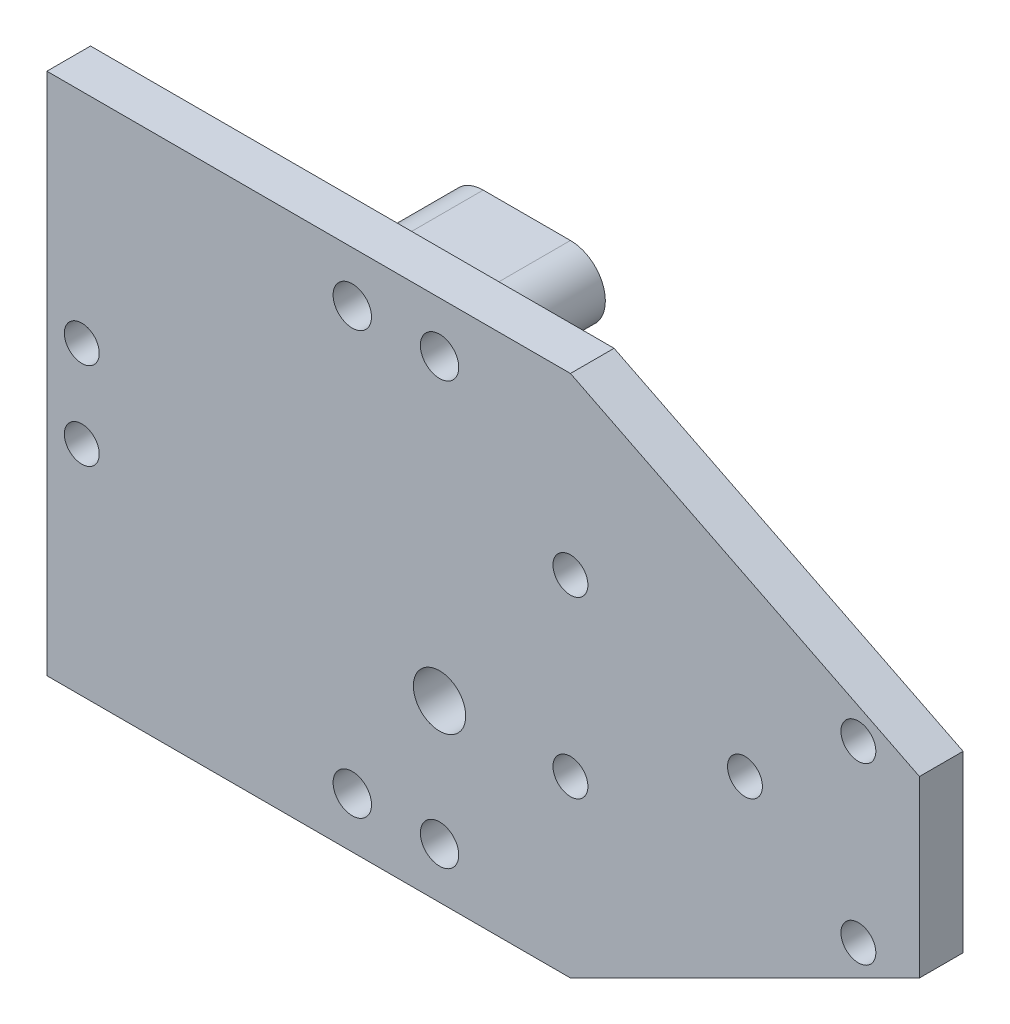
ISO-10303-21;
HEADER;
FILE_DESCRIPTION(('STEP AP214'),'2;1');
FILE_NAME('part.step','',(''),(''),'','','');
FILE_SCHEMA(('AUTOMOTIVE_DESIGN { 1 0 10303 214 1 1 1 1 }'));
ENDSEC;
DATA;
#1=APPLICATION_CONTEXT('core data for automotive mechanical design processes');
#2=APPLICATION_PROTOCOL_DEFINITION('international standard','automotive_design',2000,#1);
#3=PRODUCT_CONTEXT('',#1,'mechanical');
#4=PRODUCT('Part','Part','',(#3));
#5=PRODUCT_RELATED_PRODUCT_CATEGORY('part','',(#4));
#6=PRODUCT_DEFINITION_FORMATION('','',#4);
#7=PRODUCT_DEFINITION_CONTEXT('part definition',#1,'design');
#8=PRODUCT_DEFINITION('design','',#6,#7);
#9=PRODUCT_DEFINITION_SHAPE('','',#8);
#10=(LENGTH_UNIT() NAMED_UNIT(*) SI_UNIT(.MILLI.,.METRE.));
#11=(NAMED_UNIT(*) PLANE_ANGLE_UNIT() SI_UNIT($,.RADIAN.));
#12=(NAMED_UNIT(*) SI_UNIT($,.STERADIAN.) SOLID_ANGLE_UNIT());
#13=UNCERTAINTY_MEASURE_WITH_UNIT(LENGTH_MEASURE(1.E-05),#10,'distance_accuracy_value','');
#14=(GEOMETRIC_REPRESENTATION_CONTEXT(3) GLOBAL_UNCERTAINTY_ASSIGNED_CONTEXT((#13)) GLOBAL_UNIT_ASSIGNED_CONTEXT((#10,
#11,#12)) REPRESENTATION_CONTEXT('',''));
#15=CARTESIAN_POINT('',(0.,0.,0.));
#16=DIRECTION('',(0.,0.,1.));
#17=DIRECTION('',(1.,0.,0.));
#18=AXIS2_PLACEMENT_3D('',#15,#16,#17);
#19=CARTESIAN_POINT('',(0.,0.,2.5));
#20=DIRECTION('',(0.,0.,1.));
#21=DIRECTION('',(1.,0.,0.));
#22=AXIS2_PLACEMENT_3D('',#19,#20,#21);
#23=PLANE('',#22);
#24=CARTESIAN_POINT('',(80.,10.,2.5));
#25=DIRECTION('',(0.,0.,1.));
#26=DIRECTION('',(1.,0.,0.));
#27=AXIS2_PLACEMENT_3D('',#24,#25,#26);
#28=CIRCLE('',#27,2.);
#29=CARTESIAN_POINT('',(82.,10.,2.5));
#30=VERTEX_POINT('',#29);
#31=EDGE_CURVE('E218',#30,#30,#28,.T.);
#32=ORIENTED_EDGE('',*,*,#31,.F.);
#33=EDGE_LOOP('',(#32));
#34=FACE_BOUND('',#33,.T.);
#35=CARTESIAN_POINT('',(4.,5.,2.5));
#36=DIRECTION('',(0.,0.,1.));
#37=DIRECTION('',(1.,0.,0.));
#38=AXIS2_PLACEMENT_3D('',#35,#36,#37);
#39=CIRCLE('',#38,2.);
#40=CARTESIAN_POINT('',(6.,5.,2.5));
#41=VERTEX_POINT('',#40);
#42=EDGE_CURVE('E224',#41,#41,#39,.T.);
#43=ORIENTED_EDGE('',*,*,#42,.F.);
#44=EDGE_LOOP('',(#43));
#45=FACE_BOUND('',#44,.T.);
#46=CARTESIAN_POINT('',(4.,15.,2.5));
#47=DIRECTION('',(0.,0.,1.));
#48=DIRECTION('',(1.,0.,0.));
#49=AXIS2_PLACEMENT_3D('',#46,#47,#48);
#50=CIRCLE('',#49,2.);
#51=CARTESIAN_POINT('',(6.,15.,2.5));
#52=VERTEX_POINT('',#51);
#53=EDGE_CURVE('E208',#52,#52,#50,.T.);
#54=ORIENTED_EDGE('',*,*,#53,.F.);
#55=EDGE_LOOP('',(#54));
#56=FACE_BOUND('',#55,.T.);
#57=CARTESIAN_POINT('',(35.,-14.2,2.5));
#58=DIRECTION('',(0.,0.,1.));
#59=DIRECTION('',(1.,0.,0.));
#60=AXIS2_PLACEMENT_3D('',#57,#58,#59);
#61=CIRCLE('',#60,2.2);
#62=CARTESIAN_POINT('',(37.2,-14.2,2.5));
#63=VERTEX_POINT('',#62);
#64=EDGE_CURVE('E234',#63,#63,#61,.T.);
#65=ORIENTED_EDGE('',*,*,#64,.F.);
#66=EDGE_LOOP('',(#65));
#67=FACE_BOUND('',#66,.T.);
#68=CARTESIAN_POINT('',(35.,34.2,2.5));
#69=DIRECTION('',(0.,0.,1.));
#70=DIRECTION('',(1.,0.,0.));
#71=AXIS2_PLACEMENT_3D('',#68,#69,#70);
#72=CIRCLE('',#71,2.2);
#73=CARTESIAN_POINT('',(37.2,34.2,2.5));
#74=VERTEX_POINT('',#73);
#75=EDGE_CURVE('E240',#74,#74,#72,.T.);
#76=ORIENTED_EDGE('',*,*,#75,.F.);
#77=EDGE_LOOP('',(#76));
#78=FACE_BOUND('',#77,.T.);
#79=CARTESIAN_POINT('',(93.,0.,2.5));
#80=DIRECTION('',(0.,0.,1.));
#81=DIRECTION('',(1.,0.,0.));
#82=AXIS2_PLACEMENT_3D('',#79,#80,#81);
#83=CIRCLE('',#82,2.);
#84=CARTESIAN_POINT('',(95.,0.,2.5));
#85=VERTEX_POINT('',#84);
#86=EDGE_CURVE('E250',#85,#85,#83,.T.);
#87=ORIENTED_EDGE('',*,*,#86,.F.);
#88=EDGE_LOOP('',(#87));
#89=FACE_BOUND('',#88,.T.);
#90=CARTESIAN_POINT('',(60.,0.,2.5));
#91=DIRECTION('',(0.,0.,1.));
#92=DIRECTION('',(1.,0.,0.));
#93=AXIS2_PLACEMENT_3D('',#90,#91,#92);
#94=CIRCLE('',#93,2.);
#95=CARTESIAN_POINT('',(62.,0.,2.5));
#96=VERTEX_POINT('',#95);
#97=EDGE_CURVE('E262',#96,#96,#94,.T.);
#98=ORIENTED_EDGE('',*,*,#97,.F.);
#99=EDGE_LOOP('',(#98));
#100=FACE_BOUND('',#99,.T.);
#101=DIRECTION('',(0.,-1.,0.));
#102=VECTOR('',#101,1.);
#103=CARTESIAN_POINT('',(0.,40.,2.5));
#104=LINE('',#103,#102);
#105=CARTESIAN_POINT('',(0.,40.,2.5));
#106=VERTEX_POINT('',#105);
#107=CARTESIAN_POINT('',(0.,-20.,2.5));
#108=VERTEX_POINT('',#107);
#109=EDGE_CURVE('E274',#106,#108,#104,.T.);
#110=ORIENTED_EDGE('',*,*,#109,.T.);
#111=DIRECTION('',(1.,0.,0.));
#112=VECTOR('',#111,1.);
#113=CARTESIAN_POINT('',(0.,-20.,2.5));
#114=LINE('',#113,#112);
#115=CARTESIAN_POINT('',(60.,-20.,2.5));
#116=VERTEX_POINT('',#115);
#117=EDGE_CURVE('E277',#108,#116,#114,.T.);
#118=ORIENTED_EDGE('',*,*,#117,.T.);
#119=DIRECTION('',(0.894427190999916,0.447213595499958,0.));
#120=VECTOR('',#119,1.);
#121=CARTESIAN_POINT('',(60.,-20.,2.5));
#122=LINE('',#121,#120);
#123=CARTESIAN_POINT('',(100.,0.,2.5));
#124=VERTEX_POINT('',#123);
#125=EDGE_CURVE('E280',#116,#124,#122,.T.);
#126=ORIENTED_EDGE('',*,*,#125,.T.);
#127=DIRECTION('',(0.,1.,0.));
#128=VECTOR('',#127,1.);
#129=CARTESIAN_POINT('',(100.,0.,2.5));
#130=LINE('',#129,#128);
#131=CARTESIAN_POINT('',(100.,20.,2.5));
#132=VERTEX_POINT('',#131);
#133=EDGE_CURVE('E282',#124,#132,#130,.T.);
#134=ORIENTED_EDGE('',*,*,#133,.T.);
#135=DIRECTION('',(-0.894427190999916,0.447213595499958,0.));
#136=VECTOR('',#135,1.);
#137=CARTESIAN_POINT('',(100.,20.,2.5));
#138=LINE('',#137,#136);
#139=CARTESIAN_POINT('',(60.,40.,2.5));
#140=VERTEX_POINT('',#139);
#141=EDGE_CURVE('E284',#132,#140,#138,.T.);
#142=ORIENTED_EDGE('',*,*,#141,.T.);
#143=DIRECTION('',(-1.,0.,0.));
#144=VECTOR('',#143,1.);
#145=CARTESIAN_POINT('',(60.,40.,2.5));
#146=LINE('',#145,#144);
#147=EDGE_CURVE('E286',#140,#106,#146,.T.);
#148=ORIENTED_EDGE('',*,*,#147,.T.);
#149=EDGE_LOOP('',(#110,#118,#126,#134,#142,#148));
#150=FACE_BOUND('',#149,.T.);
#151=CARTESIAN_POINT('',(60.,20.,2.5));
#152=DIRECTION('',(0.,0.,1.));
#153=DIRECTION('',(1.,0.,0.));
#154=AXIS2_PLACEMENT_3D('',#151,#152,#153);
#155=CIRCLE('',#154,2.);
#156=CARTESIAN_POINT('',(62.,20.,2.5));
#157=VERTEX_POINT('',#156);
#158=EDGE_CURVE('E268',#157,#157,#155,.T.);
#159=ORIENTED_EDGE('',*,*,#158,.F.);
#160=EDGE_LOOP('',(#159));
#161=FACE_BOUND('',#160,.T.);
#162=CARTESIAN_POINT('',(93.,20.,2.5));
#163=DIRECTION('',(0.,0.,1.));
#164=DIRECTION('',(1.,0.,0.));
#165=AXIS2_PLACEMENT_3D('',#162,#163,#164);
#166=CIRCLE('',#165,2.);
#167=CARTESIAN_POINT('',(95.,20.,2.5));
#168=VERTEX_POINT('',#167);
#169=EDGE_CURVE('E256',#168,#168,#166,.T.);
#170=ORIENTED_EDGE('',*,*,#169,.F.);
#171=EDGE_LOOP('',(#170));
#172=FACE_BOUND('',#171,.T.);
#173=CARTESIAN_POINT('',(45.,0.,2.5));
#174=DIRECTION('',(0.,0.,1.));
#175=DIRECTION('',(1.,0.,0.));
#176=AXIS2_PLACEMENT_3D('',#173,#174,#175);
#177=CIRCLE('',#176,3.);
#178=CARTESIAN_POINT('',(48.,0.,2.5));
#179=VERTEX_POINT('',#178);
#180=EDGE_CURVE('E244',#179,#179,#177,.T.);
#181=ORIENTED_EDGE('',*,*,#180,.F.);
#182=EDGE_LOOP('',(#181));
#183=FACE_BOUND('',#182,.T.);
#184=CARTESIAN_POINT('',(45.,34.2,2.5));
#185=DIRECTION('',(0.,0.,1.));
#186=DIRECTION('',(1.,0.,0.));
#187=AXIS2_PLACEMENT_3D('',#184,#185,#186);
#188=CIRCLE('',#187,2.2);
#189=CARTESIAN_POINT('',(47.2,34.2,2.5));
#190=VERTEX_POINT('',#189);
#191=EDGE_CURVE('E237',#190,#190,#188,.T.);
#192=ORIENTED_EDGE('',*,*,#191,.F.);
#193=EDGE_LOOP('',(#192));
#194=FACE_BOUND('',#193,.T.);
#195=CARTESIAN_POINT('',(45.,-14.2,2.5));
#196=DIRECTION('',(0.,0.,1.));
#197=DIRECTION('',(1.,0.,0.));
#198=AXIS2_PLACEMENT_3D('',#195,#196,#197);
#199=CIRCLE('',#198,2.2);
#200=CARTESIAN_POINT('',(47.2,-14.2,2.5));
#201=VERTEX_POINT('',#200);
#202=EDGE_CURVE('E217',#201,#201,#199,.T.);
#203=ORIENTED_EDGE('',*,*,#202,.F.);
#204=EDGE_LOOP('',(#203));
#205=FACE_BOUND('',#204,.T.);
#206=ADVANCED_FACE('F33',(#34,#45,#56,#67,#78,#89,#100,#150,#161,#172,#183,#194,#205),#23,.T.);
#207=CARTESIAN_POINT('',(0.,0.,-2.5));
#208=DIRECTION('',(0.,0.,1.));
#209=DIRECTION('',(1.,0.,0.));
#210=AXIS2_PLACEMENT_3D('',#207,#208,#209);
#211=PLANE('',#210);
#212=DIRECTION('',(-1.,0.,0.));
#213=VECTOR('',#212,1.);
#214=CARTESIAN_POINT('',(0.,-10.2,-2.5));
#215=LINE('',#214,#213);
#216=CARTESIAN_POINT('',(45.,-10.2,-2.5));
#217=VERTEX_POINT('',#216);
#218=CARTESIAN_POINT('',(35.,-10.2,-2.5));
#219=VERTEX_POINT('',#218);
#220=EDGE_CURVE('E159',#217,#219,#215,.T.);
#221=ORIENTED_EDGE('',*,*,#220,.T.);
#222=CARTESIAN_POINT('',(35.,-14.2,-2.5));
#223=DIRECTION('',(0.,0.,1.));
#224=DIRECTION('',(1.,0.,0.));
#225=AXIS2_PLACEMENT_3D('',#222,#223,#224);
#226=CIRCLE('',#225,4.00000000000001);
#227=CARTESIAN_POINT('',(35.,-18.2,-2.5));
#228=VERTEX_POINT('',#227);
#229=EDGE_CURVE('E169',#219,#228,#226,.T.);
#230=ORIENTED_EDGE('',*,*,#229,.T.);
#231=DIRECTION('',(1.,0.,0.));
#232=VECTOR('',#231,1.);
#233=CARTESIAN_POINT('',(0.,-18.2,-2.5));
#234=LINE('',#233,#232);
#235=CARTESIAN_POINT('',(45.,-18.2,-2.5));
#236=VERTEX_POINT('',#235);
#237=EDGE_CURVE('E139',#228,#236,#234,.T.);
#238=ORIENTED_EDGE('',*,*,#237,.T.);
#239=CARTESIAN_POINT('',(45.,-14.2,-2.5));
#240=DIRECTION('',(0.,0.,1.));
#241=DIRECTION('',(1.,0.,0.));
#242=AXIS2_PLACEMENT_3D('',#239,#240,#241);
#243=CIRCLE('',#242,4.00000000000001);
#244=EDGE_CURVE('E48',#236,#217,#243,.T.);
#245=ORIENTED_EDGE('',*,*,#244,.T.);
#246=EDGE_LOOP('',(#221,#230,#238,#245));
#247=FACE_BOUND('',#246,.T.);
#248=DIRECTION('',(-1.,0.,0.));
#249=VECTOR('',#248,1.);
#250=CARTESIAN_POINT('',(0.,38.2,-2.5));
#251=LINE('',#250,#249);
#252=CARTESIAN_POINT('',(45.,38.2,-2.5));
#253=VERTEX_POINT('',#252);
#254=CARTESIAN_POINT('',(35.,38.2,-2.5));
#255=VERTEX_POINT('',#254);
#256=EDGE_CURVE('E188',#253,#255,#251,.T.);
#257=ORIENTED_EDGE('',*,*,#256,.T.);
#258=CARTESIAN_POINT('',(35.,34.2,-2.5));
#259=DIRECTION('',(0.,0.,1.));
#260=DIRECTION('',(1.,0.,0.));
#261=AXIS2_PLACEMENT_3D('',#258,#259,#260);
#262=CIRCLE('',#261,4.);
#263=CARTESIAN_POINT('',(35.,30.2,-2.5));
#264=VERTEX_POINT('',#263);
#265=EDGE_CURVE('E183',#255,#264,#262,.T.);
#266=ORIENTED_EDGE('',*,*,#265,.T.);
#267=DIRECTION('',(1.,0.,0.));
#268=VECTOR('',#267,1.);
#269=CARTESIAN_POINT('',(0.,30.2,-2.5));
#270=LINE('',#269,#268);
#271=CARTESIAN_POINT('',(45.,30.2,-2.5));
#272=VERTEX_POINT('',#271);
#273=EDGE_CURVE('E200',#264,#272,#270,.T.);
#274=ORIENTED_EDGE('',*,*,#273,.T.);
#275=CARTESIAN_POINT('',(45.,34.2,-2.5));
#276=DIRECTION('',(0.,0.,1.));
#277=DIRECTION('',(1.,0.,0.));
#278=AXIS2_PLACEMENT_3D('',#275,#276,#277);
#279=CIRCLE('',#278,4.);
#280=EDGE_CURVE('E56',#272,#253,#279,.T.);
#281=ORIENTED_EDGE('',*,*,#280,.T.);
#282=EDGE_LOOP('',(#257,#266,#274,#281));
#283=FACE_BOUND('',#282,.T.);
#284=CARTESIAN_POINT('',(80.,10.,-2.5));
#285=DIRECTION('',(0.,0.,1.));
#286=DIRECTION('',(1.,0.,0.));
#287=AXIS2_PLACEMENT_3D('',#284,#285,#286);
#288=CIRCLE('',#287,2.);
#289=CARTESIAN_POINT('',(82.,10.,-2.5));
#290=VERTEX_POINT('',#289);
#291=EDGE_CURVE('E214',#290,#290,#288,.T.);
#292=ORIENTED_EDGE('',*,*,#291,.T.);
#293=EDGE_LOOP('',(#292));
#294=FACE_BOUND('',#293,.T.);
#295=CARTESIAN_POINT('',(4.,5.,-2.5));
#296=DIRECTION('',(0.,0.,1.));
#297=DIRECTION('',(1.,0.,0.));
#298=AXIS2_PLACEMENT_3D('',#295,#296,#297);
#299=CIRCLE('',#298,2.);
#300=CARTESIAN_POINT('',(6.,5.,-2.5));
#301=VERTEX_POINT('',#300);
#302=EDGE_CURVE('E221',#301,#301,#299,.T.);
#303=ORIENTED_EDGE('',*,*,#302,.T.);
#304=EDGE_LOOP('',(#303));
#305=FACE_BOUND('',#304,.T.);
#306=CARTESIAN_POINT('',(4.,15.,-2.5));
#307=DIRECTION('',(0.,0.,1.));
#308=DIRECTION('',(1.,0.,0.));
#309=AXIS2_PLACEMENT_3D('',#306,#307,#308);
#310=CIRCLE('',#309,2.);
#311=CARTESIAN_POINT('',(6.,15.,-2.5));
#312=VERTEX_POINT('',#311);
#313=EDGE_CURVE('E227',#312,#312,#310,.T.);
#314=ORIENTED_EDGE('',*,*,#313,.T.);
#315=EDGE_LOOP('',(#314));
#316=FACE_BOUND('',#315,.T.);
#317=DIRECTION('',(0.,-1.,0.));
#318=VECTOR('',#317,1.);
#319=CARTESIAN_POINT('',(0.,40.,-2.5));
#320=LINE('',#319,#318);
#321=CARTESIAN_POINT('',(0.,40.,-2.5));
#322=VERTEX_POINT('',#321);
#323=CARTESIAN_POINT('',(0.,-20.,-2.5));
#324=VERTEX_POINT('',#323);
#325=EDGE_CURVE('E271',#322,#324,#320,.T.);
#326=ORIENTED_EDGE('',*,*,#325,.F.);
#327=DIRECTION('',(-1.,0.,0.));
#328=VECTOR('',#327,1.);
#329=CARTESIAN_POINT('',(60.,40.,-2.5));
#330=LINE('',#329,#328);
#331=CARTESIAN_POINT('',(60.,40.,-2.5));
#332=VERTEX_POINT('',#331);
#333=EDGE_CURVE('E278',#332,#322,#330,.T.);
#334=ORIENTED_EDGE('',*,*,#333,.F.);
#335=DIRECTION('',(-0.894427190999916,0.447213595499958,0.));
#336=VECTOR('',#335,1.);
#337=CARTESIAN_POINT('',(100.,20.,-2.5));
#338=LINE('',#337,#336);
#339=CARTESIAN_POINT('',(100.,20.,-2.5));
#340=VERTEX_POINT('',#339);
#341=EDGE_CURVE('E297',#340,#332,#338,.T.);
#342=ORIENTED_EDGE('',*,*,#341,.F.);
#343=DIRECTION('',(0.,1.,0.));
#344=VECTOR('',#343,1.);
#345=CARTESIAN_POINT('',(100.,0.,-2.5));
#346=LINE('',#345,#344);
#347=CARTESIAN_POINT('',(100.,0.,-2.5));
#348=VERTEX_POINT('',#347);
#349=EDGE_CURVE('E295',#348,#340,#346,.T.);
#350=ORIENTED_EDGE('',*,*,#349,.F.);
#351=DIRECTION('',(0.894427190999916,0.447213595499958,0.));
#352=VECTOR('',#351,1.);
#353=CARTESIAN_POINT('',(60.,-20.,-2.5));
#354=LINE('',#353,#352);
#355=CARTESIAN_POINT('',(60.,-20.,-2.5));
#356=VERTEX_POINT('',#355);
#357=EDGE_CURVE('E293',#356,#348,#354,.T.);
#358=ORIENTED_EDGE('',*,*,#357,.F.);
#359=DIRECTION('',(1.,0.,0.));
#360=VECTOR('',#359,1.);
#361=CARTESIAN_POINT('',(0.,-20.,-2.5));
#362=LINE('',#361,#360);
#363=EDGE_CURVE('E291',#324,#356,#362,.T.);
#364=ORIENTED_EDGE('',*,*,#363,.F.);
#365=EDGE_LOOP('',(#326,#334,#342,#350,#358,#364));
#366=FACE_BOUND('',#365,.T.);
#367=CARTESIAN_POINT('',(60.,20.,-2.5));
#368=DIRECTION('',(0.,0.,1.));
#369=DIRECTION('',(1.,0.,0.));
#370=AXIS2_PLACEMENT_3D('',#367,#368,#369);
#371=CIRCLE('',#370,2.);
#372=CARTESIAN_POINT('',(62.,20.,-2.5));
#373=VERTEX_POINT('',#372);
#374=EDGE_CURVE('E265',#373,#373,#371,.T.);
#375=ORIENTED_EDGE('',*,*,#374,.T.);
#376=EDGE_LOOP('',(#375));
#377=FACE_BOUND('',#376,.T.);
#378=CARTESIAN_POINT('',(60.,0.,-2.5));
#379=DIRECTION('',(0.,0.,1.));
#380=DIRECTION('',(1.,0.,0.));
#381=AXIS2_PLACEMENT_3D('',#378,#379,#380);
#382=CIRCLE('',#381,2.);
#383=CARTESIAN_POINT('',(62.,0.,-2.5));
#384=VERTEX_POINT('',#383);
#385=EDGE_CURVE('E259',#384,#384,#382,.T.);
#386=ORIENTED_EDGE('',*,*,#385,.T.);
#387=EDGE_LOOP('',(#386));
#388=FACE_BOUND('',#387,.T.);
#389=CARTESIAN_POINT('',(93.,20.,-2.5));
#390=DIRECTION('',(0.,0.,1.));
#391=DIRECTION('',(1.,0.,0.));
#392=AXIS2_PLACEMENT_3D('',#389,#390,#391);
#393=CIRCLE('',#392,2.);
#394=CARTESIAN_POINT('',(95.,20.,-2.5));
#395=VERTEX_POINT('',#394);
#396=EDGE_CURVE('E253',#395,#395,#393,.T.);
#397=ORIENTED_EDGE('',*,*,#396,.T.);
#398=EDGE_LOOP('',(#397));
#399=FACE_BOUND('',#398,.T.);
#400=CARTESIAN_POINT('',(93.,0.,-2.5));
#401=DIRECTION('',(0.,0.,1.));
#402=DIRECTION('',(1.,0.,0.));
#403=AXIS2_PLACEMENT_3D('',#400,#401,#402);
#404=CIRCLE('',#403,2.);
#405=CARTESIAN_POINT('',(95.,0.,-2.5));
#406=VERTEX_POINT('',#405);
#407=EDGE_CURVE('E247',#406,#406,#404,.T.);
#408=ORIENTED_EDGE('',*,*,#407,.T.);
#409=EDGE_LOOP('',(#408));
#410=FACE_BOUND('',#409,.T.);
#411=CARTESIAN_POINT('',(45.,0.,-2.5));
#412=DIRECTION('',(0.,0.,1.));
#413=DIRECTION('',(1.,0.,0.));
#414=AXIS2_PLACEMENT_3D('',#411,#412,#413);
#415=CIRCLE('',#414,3.);
#416=CARTESIAN_POINT('',(48.,0.,-2.5));
#417=VERTEX_POINT('',#416);
#418=EDGE_CURVE('E243',#417,#417,#415,.T.);
#419=ORIENTED_EDGE('',*,*,#418,.T.);
#420=EDGE_LOOP('',(#419));
#421=FACE_BOUND('',#420,.T.);
#422=ADVANCED_FACE('F321',(#247,#283,#294,#305,#316,#366,#377,#388,#399,#410,#421),#211,.F.);
#423=CARTESIAN_POINT('',(0.,40.,2.5));
#424=DIRECTION('',(1.,0.,0.));
#425=DIRECTION('',(0.,0.,-1.));
#426=AXIS2_PLACEMENT_3D('',#423,#424,#425);
#427=PLANE('',#426);
#428=ORIENTED_EDGE('',*,*,#325,.T.);
#429=DIRECTION('',(0.,0.,-1.));
#430=VECTOR('',#429,1.);
#431=CARTESIAN_POINT('',(0.,-20.,2.5));
#432=LINE('',#431,#430);
#433=EDGE_CURVE('E11',#108,#324,#432,.T.);
#434=ORIENTED_EDGE('',*,*,#433,.F.);
#435=ORIENTED_EDGE('',*,*,#109,.F.);
#436=DIRECTION('',(0.,0.,-1.));
#437=VECTOR('',#436,1.);
#438=CARTESIAN_POINT('',(0.,40.,2.5));
#439=LINE('',#438,#437);
#440=EDGE_CURVE('E288',#106,#322,#439,.T.);
#441=ORIENTED_EDGE('',*,*,#440,.T.);
#442=EDGE_LOOP('',(#428,#434,#435,#441));
#443=FACE_BOUND('',#442,.T.);
#444=ADVANCED_FACE('F35',(#443),#427,.F.);
#445=CARTESIAN_POINT('',(0.,-20.,2.5));
#446=DIRECTION('',(0.,1.,0.));
#447=DIRECTION('',(-1.,0.,0.));
#448=AXIS2_PLACEMENT_3D('',#445,#446,#447);
#449=PLANE('',#448);
#450=ORIENTED_EDGE('',*,*,#363,.T.);
#451=DIRECTION('',(0.,0.,-1.));
#452=VECTOR('',#451,1.);
#453=CARTESIAN_POINT('',(60.,-20.,2.5));
#454=LINE('',#453,#452);
#455=EDGE_CURVE('E41',#116,#356,#454,.T.);
#456=ORIENTED_EDGE('',*,*,#455,.F.);
#457=ORIENTED_EDGE('',*,*,#117,.F.);
#458=ORIENTED_EDGE('',*,*,#433,.T.);
#459=EDGE_LOOP('',(#450,#456,#457,#458));
#460=FACE_BOUND('',#459,.T.);
#461=ADVANCED_FACE('F339',(#460),#449,.F.);
#462=CARTESIAN_POINT('',(60.,-20.,2.5));
#463=DIRECTION('',(-0.447213595499958,0.894427190999916,0.));
#464=DIRECTION('',(-0.894427190999916,-0.447213595499958,0.));
#465=AXIS2_PLACEMENT_3D('',#462,#463,#464);
#466=PLANE('',#465);
#467=ORIENTED_EDGE('',*,*,#357,.T.);
#468=DIRECTION('',(0.,0.,-1.));
#469=VECTOR('',#468,1.);
#470=CARTESIAN_POINT('',(100.,0.,2.5));
#471=LINE('',#470,#469);
#472=EDGE_CURVE('E308',#124,#348,#471,.T.);
#473=ORIENTED_EDGE('',*,*,#472,.F.);
#474=ORIENTED_EDGE('',*,*,#125,.F.);
#475=ORIENTED_EDGE('',*,*,#455,.T.);
#476=EDGE_LOOP('',(#467,#473,#474,#475));
#477=FACE_BOUND('',#476,.T.);
#478=ADVANCED_FACE('F315',(#477),#466,.F.);
#479=CARTESIAN_POINT('',(100.,0.,2.5));
#480=DIRECTION('',(-1.,0.,0.));
#481=DIRECTION('',(0.,0.,1.));
#482=AXIS2_PLACEMENT_3D('',#479,#480,#481);
#483=PLANE('',#482);
#484=ORIENTED_EDGE('',*,*,#349,.T.);
#485=DIRECTION('',(0.,0.,-1.));
#486=VECTOR('',#485,1.);
#487=CARTESIAN_POINT('',(100.,20.,2.5));
#488=LINE('',#487,#486);
#489=EDGE_CURVE('E305',#132,#340,#488,.T.);
#490=ORIENTED_EDGE('',*,*,#489,.F.);
#491=ORIENTED_EDGE('',*,*,#133,.F.);
#492=ORIENTED_EDGE('',*,*,#472,.T.);
#493=EDGE_LOOP('',(#484,#490,#491,#492));
#494=FACE_BOUND('',#493,.T.);
#495=ADVANCED_FACE('F327',(#494),#483,.F.);
#496=CARTESIAN_POINT('',(100.,20.,2.5));
#497=DIRECTION('',(-0.447213595499958,-0.894427190999916,0.));
#498=DIRECTION('',(0.894427190999916,-0.447213595499958,0.));
#499=AXIS2_PLACEMENT_3D('',#496,#497,#498);
#500=PLANE('',#499);
#501=ORIENTED_EDGE('',*,*,#341,.T.);
#502=DIRECTION('',(0.,0.,-1.));
#503=VECTOR('',#502,1.);
#504=CARTESIAN_POINT('',(60.,40.,2.5));
#505=LINE('',#504,#503);
#506=EDGE_CURVE('E302',#140,#332,#505,.T.);
#507=ORIENTED_EDGE('',*,*,#506,.F.);
#508=ORIENTED_EDGE('',*,*,#141,.F.);
#509=ORIENTED_EDGE('',*,*,#489,.T.);
#510=EDGE_LOOP('',(#501,#507,#508,#509));
#511=FACE_BOUND('',#510,.T.);
#512=ADVANCED_FACE('F331',(#511),#500,.F.);
#513=CARTESIAN_POINT('',(60.,40.,2.5));
#514=DIRECTION('',(0.,-1.,0.));
#515=DIRECTION('',(1.,0.,0.));
#516=AXIS2_PLACEMENT_3D('',#513,#514,#515);
#517=PLANE('',#516);
#518=ORIENTED_EDGE('',*,*,#333,.T.);
#519=ORIENTED_EDGE('',*,*,#440,.F.);
#520=ORIENTED_EDGE('',*,*,#147,.F.);
#521=ORIENTED_EDGE('',*,*,#506,.T.);
#522=EDGE_LOOP('',(#518,#519,#520,#521));
#523=FACE_BOUND('',#522,.T.);
#524=ADVANCED_FACE('F342',(#523),#517,.F.);
#525=CARTESIAN_POINT('',(60.,20.,2.5));
#526=DIRECTION('',(0.,0.,-1.));
#527=DIRECTION('',(-1.,0.,0.));
#528=AXIS2_PLACEMENT_3D('',#525,#526,#527);
#529=CYLINDRICAL_SURFACE('',#528,2.);
#530=ORIENTED_EDGE('',*,*,#158,.T.);
#531=EDGE_LOOP('',(#530));
#532=FACE_BOUND('',#531,.T.);
#533=ORIENTED_EDGE('',*,*,#374,.F.);
#534=EDGE_LOOP('',(#533));
#535=FACE_BOUND('',#534,.T.);
#536=ADVANCED_FACE('F344',(#532,#535),#529,.F.);
#537=CARTESIAN_POINT('',(60.,0.,2.5));
#538=DIRECTION('',(0.,0.,-1.));
#539=DIRECTION('',(-1.,0.,0.));
#540=AXIS2_PLACEMENT_3D('',#537,#538,#539);
#541=CYLINDRICAL_SURFACE('',#540,2.);
#542=ORIENTED_EDGE('',*,*,#97,.T.);
#543=EDGE_LOOP('',(#542));
#544=FACE_BOUND('',#543,.T.);
#545=ORIENTED_EDGE('',*,*,#385,.F.);
#546=EDGE_LOOP('',(#545));
#547=FACE_BOUND('',#546,.T.);
#548=ADVANCED_FACE('F350',(#544,#547),#541,.F.);
#549=CARTESIAN_POINT('',(93.,20.,2.5));
#550=DIRECTION('',(0.,0.,-1.));
#551=DIRECTION('',(-1.,0.,0.));
#552=AXIS2_PLACEMENT_3D('',#549,#550,#551);
#553=CYLINDRICAL_SURFACE('',#552,2.);
#554=ORIENTED_EDGE('',*,*,#169,.T.);
#555=EDGE_LOOP('',(#554));
#556=FACE_BOUND('',#555,.T.);
#557=ORIENTED_EDGE('',*,*,#396,.F.);
#558=EDGE_LOOP('',(#557));
#559=FACE_BOUND('',#558,.T.);
#560=ADVANCED_FACE('F367',(#556,#559),#553,.F.);
#561=CARTESIAN_POINT('',(93.,0.,2.5));
#562=DIRECTION('',(0.,0.,-1.));
#563=DIRECTION('',(-1.,0.,0.));
#564=AXIS2_PLACEMENT_3D('',#561,#562,#563);
#565=CYLINDRICAL_SURFACE('',#564,2.);
#566=ORIENTED_EDGE('',*,*,#86,.T.);
#567=EDGE_LOOP('',(#566));
#568=FACE_BOUND('',#567,.T.);
#569=ORIENTED_EDGE('',*,*,#407,.F.);
#570=EDGE_LOOP('',(#569));
#571=FACE_BOUND('',#570,.T.);
#572=ADVANCED_FACE('F371',(#568,#571),#565,.F.);
#573=CARTESIAN_POINT('',(45.,0.,2.5));
#574=DIRECTION('',(0.,0.,-1.));
#575=DIRECTION('',(-1.,0.,0.));
#576=AXIS2_PLACEMENT_3D('',#573,#574,#575);
#577=CYLINDRICAL_SURFACE('',#576,3.);
#578=ORIENTED_EDGE('',*,*,#180,.T.);
#579=EDGE_LOOP('',(#578));
#580=FACE_BOUND('',#579,.T.);
#581=ORIENTED_EDGE('',*,*,#418,.F.);
#582=EDGE_LOOP('',(#581));
#583=FACE_BOUND('',#582,.T.);
#584=ADVANCED_FACE('F375',(#580,#583),#577,.F.);
#585=CARTESIAN_POINT('',(35.,34.2,2.5));
#586=DIRECTION('',(0.,0.,-1.));
#587=DIRECTION('',(-1.,0.,0.));
#588=AXIS2_PLACEMENT_3D('',#585,#586,#587);
#589=CYLINDRICAL_SURFACE('',#588,2.2);
#590=ORIENTED_EDGE('',*,*,#75,.T.);
#591=EDGE_LOOP('',(#590));
#592=FACE_BOUND('',#591,.T.);
#593=CARTESIAN_POINT('',(35.,34.2,-12.5));
#594=DIRECTION('',(0.,0.,1.));
#595=DIRECTION('',(1.,0.,0.));
#596=AXIS2_PLACEMENT_3D('',#593,#594,#595);
#597=CIRCLE('',#596,2.20000000000001);
#598=CARTESIAN_POINT('',(37.2,34.2,-12.5));
#599=VERTEX_POINT('',#598);
#600=EDGE_CURVE('E180',#599,#599,#597,.T.);
#601=ORIENTED_EDGE('',*,*,#600,.F.);
#602=EDGE_LOOP('',(#601));
#603=FACE_BOUND('',#602,.T.);
#604=ADVANCED_FACE('F379',(#592,#603),#589,.F.);
#605=CARTESIAN_POINT('',(45.,34.2,2.5));
#606=DIRECTION('',(0.,0.,-1.));
#607=DIRECTION('',(-1.,0.,0.));
#608=AXIS2_PLACEMENT_3D('',#605,#606,#607);
#609=CYLINDRICAL_SURFACE('',#608,2.2);
#610=ORIENTED_EDGE('',*,*,#191,.T.);
#611=EDGE_LOOP('',(#610));
#612=FACE_BOUND('',#611,.T.);
#613=CARTESIAN_POINT('',(45.,34.2,-12.5));
#614=DIRECTION('',(0.,0.,1.));
#615=DIRECTION('',(1.,0.,0.));
#616=AXIS2_PLACEMENT_3D('',#613,#614,#615);
#617=CIRCLE('',#616,2.2);
#618=CARTESIAN_POINT('',(47.2,34.2,-12.5));
#619=VERTEX_POINT('',#618);
#620=EDGE_CURVE('E174',#619,#619,#617,.T.);
#621=ORIENTED_EDGE('',*,*,#620,.F.);
#622=EDGE_LOOP('',(#621));
#623=FACE_BOUND('',#622,.T.);
#624=ADVANCED_FACE('F383',(#612,#623),#609,.F.);
#625=CARTESIAN_POINT('',(35.,-14.2,2.5));
#626=DIRECTION('',(0.,0.,-1.));
#627=DIRECTION('',(-1.,0.,0.));
#628=AXIS2_PLACEMENT_3D('',#625,#626,#627);
#629=CYLINDRICAL_SURFACE('',#628,2.2);
#630=ORIENTED_EDGE('',*,*,#64,.T.);
#631=EDGE_LOOP('',(#630));
#632=FACE_BOUND('',#631,.T.);
#633=CARTESIAN_POINT('',(35.,-14.2,-12.5));
#634=DIRECTION('',(0.,0.,1.));
#635=DIRECTION('',(1.,0.,0.));
#636=AXIS2_PLACEMENT_3D('',#633,#634,#635);
#637=CIRCLE('',#636,2.2);
#638=CARTESIAN_POINT('',(37.2,-14.2,-12.5));
#639=VERTEX_POINT('',#638);
#640=EDGE_CURVE('E164',#639,#639,#637,.T.);
#641=ORIENTED_EDGE('',*,*,#640,.F.);
#642=EDGE_LOOP('',(#641));
#643=FACE_BOUND('',#642,.T.);
#644=ADVANCED_FACE('F387',(#632,#643),#629,.F.);
#645=CARTESIAN_POINT('',(45.,-14.2,2.5));
#646=DIRECTION('',(0.,0.,-1.));
#647=DIRECTION('',(-1.,0.,0.));
#648=AXIS2_PLACEMENT_3D('',#645,#646,#647);
#649=CYLINDRICAL_SURFACE('',#648,2.2);
#650=ORIENTED_EDGE('',*,*,#202,.T.);
#651=EDGE_LOOP('',(#650));
#652=FACE_BOUND('',#651,.T.);
#653=CARTESIAN_POINT('',(45.,-14.2,-12.5));
#654=DIRECTION('',(0.,0.,1.));
#655=DIRECTION('',(1.,0.,0.));
#656=AXIS2_PLACEMENT_3D('',#653,#654,#655);
#657=CIRCLE('',#656,2.2);
#658=CARTESIAN_POINT('',(47.2,-14.2,-12.5));
#659=VERTEX_POINT('',#658);
#660=EDGE_CURVE('E445',#659,#659,#657,.T.);
#661=ORIENTED_EDGE('',*,*,#660,.F.);
#662=EDGE_LOOP('',(#661));
#663=FACE_BOUND('',#662,.T.);
#664=ADVANCED_FACE('F391',(#652,#663),#649,.F.);
#665=CARTESIAN_POINT('',(4.,15.,-2.5));
#666=DIRECTION('',(0.,0.,1.));
#667=DIRECTION('',(1.,0.,0.));
#668=AXIS2_PLACEMENT_3D('',#665,#666,#667);
#669=CYLINDRICAL_SURFACE('',#668,2.);
#670=ORIENTED_EDGE('',*,*,#313,.F.);
#671=EDGE_LOOP('',(#670));
#672=FACE_BOUND('',#671,.T.);
#673=ORIENTED_EDGE('',*,*,#53,.T.);
#674=EDGE_LOOP('',(#673));
#675=FACE_BOUND('',#674,.T.);
#676=ADVANCED_FACE('F395',(#672,#675),#669,.F.);
#677=CARTESIAN_POINT('',(4.,5.,-2.5));
#678=DIRECTION('',(0.,0.,1.));
#679=DIRECTION('',(1.,0.,0.));
#680=AXIS2_PLACEMENT_3D('',#677,#678,#679);
#681=CYLINDRICAL_SURFACE('',#680,2.);
#682=ORIENTED_EDGE('',*,*,#302,.F.);
#683=EDGE_LOOP('',(#682));
#684=FACE_BOUND('',#683,.T.);
#685=ORIENTED_EDGE('',*,*,#42,.T.);
#686=EDGE_LOOP('',(#685));
#687=FACE_BOUND('',#686,.T.);
#688=ADVANCED_FACE('F399',(#684,#687),#681,.F.);
#689=CARTESIAN_POINT('',(80.,10.,-2.5));
#690=DIRECTION('',(0.,0.,1.));
#691=DIRECTION('',(1.,0.,0.));
#692=AXIS2_PLACEMENT_3D('',#689,#690,#691);
#693=CYLINDRICAL_SURFACE('',#692,2.);
#694=ORIENTED_EDGE('',*,*,#291,.F.);
#695=EDGE_LOOP('',(#694));
#696=FACE_BOUND('',#695,.T.);
#697=ORIENTED_EDGE('',*,*,#31,.T.);
#698=EDGE_LOOP('',(#697));
#699=FACE_BOUND('',#698,.T.);
#700=ADVANCED_FACE('F403',(#696,#699),#693,.F.);
#701=CARTESIAN_POINT('',(35.,34.2,-12.5));
#702=DIRECTION('',(0.,0.,1.));
#703=DIRECTION('',(1.,0.,0.));
#704=AXIS2_PLACEMENT_3D('',#701,#702,#703);
#705=CYLINDRICAL_SURFACE('',#704,4.);
#706=ORIENTED_EDGE('',*,*,#265,.F.);
#707=DIRECTION('',(0.,0.,1.));
#708=VECTOR('',#707,1.);
#709=CARTESIAN_POINT('',(35.,38.2,-12.5));
#710=LINE('',#709,#708);
#711=CARTESIAN_POINT('',(35.,38.2,-12.5));
#712=VERTEX_POINT('',#711);
#713=EDGE_CURVE('E206',#712,#255,#710,.T.);
#714=ORIENTED_EDGE('',*,*,#713,.F.);
#715=CARTESIAN_POINT('',(35.,34.2,-12.5));
#716=DIRECTION('',(0.,0.,1.));
#717=DIRECTION('',(1.,0.,0.));
#718=AXIS2_PLACEMENT_3D('',#715,#716,#717);
#719=CIRCLE('',#718,4.);
#720=CARTESIAN_POINT('',(35.,30.2,-12.5));
#721=VERTEX_POINT('',#720);
#722=EDGE_CURVE('E184',#712,#721,#719,.T.);
#723=ORIENTED_EDGE('',*,*,#722,.T.);
#724=DIRECTION('',(0.,0.,1.));
#725=VECTOR('',#724,1.);
#726=CARTESIAN_POINT('',(35.,30.2,-12.5));
#727=LINE('',#726,#725);
#728=EDGE_CURVE('E197',#721,#264,#727,.T.);
#729=ORIENTED_EDGE('',*,*,#728,.T.);
#730=EDGE_LOOP('',(#706,#714,#723,#729));
#731=FACE_BOUND('',#730,.T.);
#732=ADVANCED_FACE('F407',(#731),#705,.T.);
#733=CARTESIAN_POINT('',(0.,38.2,-12.5));
#734=DIRECTION('',(0.,1.,0.));
#735=DIRECTION('',(0.,0.,1.));
#736=AXIS2_PLACEMENT_3D('',#733,#734,#735);
#737=PLANE('',#736);
#738=ORIENTED_EDGE('',*,*,#256,.F.);
#739=DIRECTION('',(0.,0.,1.));
#740=VECTOR('',#739,1.);
#741=CARTESIAN_POINT('',(45.,38.2,-12.5));
#742=LINE('',#741,#740);
#743=CARTESIAN_POINT('',(45.,38.2,-12.5));
#744=VERTEX_POINT('',#743);
#745=EDGE_CURVE('E209',#744,#253,#742,.T.);
#746=ORIENTED_EDGE('',*,*,#745,.F.);
#747=DIRECTION('',(-1.,0.,0.));
#748=VECTOR('',#747,1.);
#749=CARTESIAN_POINT('',(0.,38.2,-12.5));
#750=LINE('',#749,#748);
#751=EDGE_CURVE('E194',#744,#712,#750,.T.);
#752=ORIENTED_EDGE('',*,*,#751,.T.);
#753=ORIENTED_EDGE('',*,*,#713,.T.);
#754=EDGE_LOOP('',(#738,#746,#752,#753));
#755=FACE_BOUND('',#754,.T.);
#756=ADVANCED_FACE('F411',(#755),#737,.T.);
#757=CARTESIAN_POINT('',(45.,34.2,-12.5));
#758=DIRECTION('',(0.,0.,1.));
#759=DIRECTION('',(1.,0.,0.));
#760=AXIS2_PLACEMENT_3D('',#757,#758,#759);
#761=CYLINDRICAL_SURFACE('',#760,4.);
#762=ORIENTED_EDGE('',*,*,#280,.F.);
#763=DIRECTION('',(0.,0.,1.));
#764=VECTOR('',#763,1.);
#765=CARTESIAN_POINT('',(45.,30.2,-12.5));
#766=LINE('',#765,#764);
#767=CARTESIAN_POINT('',(45.,30.2,-12.5));
#768=VERTEX_POINT('',#767);
#769=EDGE_CURVE('E211',#768,#272,#766,.T.);
#770=ORIENTED_EDGE('',*,*,#769,.F.);
#771=CARTESIAN_POINT('',(45.,34.2,-12.5));
#772=DIRECTION('',(0.,0.,1.));
#773=DIRECTION('',(1.,0.,0.));
#774=AXIS2_PLACEMENT_3D('',#771,#772,#773);
#775=CIRCLE('',#774,4.);
#776=EDGE_CURVE('E191',#768,#744,#775,.T.);
#777=ORIENTED_EDGE('',*,*,#776,.T.);
#778=ORIENTED_EDGE('',*,*,#745,.T.);
#779=EDGE_LOOP('',(#762,#770,#777,#778));
#780=FACE_BOUND('',#779,.T.);
#781=ADVANCED_FACE('F417',(#780),#761,.T.);
#782=CARTESIAN_POINT('',(0.,30.2,-12.5));
#783=DIRECTION('',(0.,-1.,0.));
#784=DIRECTION('',(0.,0.,-1.));
#785=AXIS2_PLACEMENT_3D('',#782,#783,#784);
#786=PLANE('',#785);
#787=ORIENTED_EDGE('',*,*,#273,.F.);
#788=ORIENTED_EDGE('',*,*,#728,.F.);
#789=DIRECTION('',(1.,0.,0.));
#790=VECTOR('',#789,1.);
#791=CARTESIAN_POINT('',(0.,30.2,-12.5));
#792=LINE('',#791,#790);
#793=EDGE_CURVE('E187',#721,#768,#792,.T.);
#794=ORIENTED_EDGE('',*,*,#793,.T.);
#795=ORIENTED_EDGE('',*,*,#769,.T.);
#796=EDGE_LOOP('',(#787,#788,#794,#795));
#797=FACE_BOUND('',#796,.T.);
#798=ADVANCED_FACE('F413',(#797),#786,.T.);
#799=CARTESIAN_POINT('',(35.,34.2,-12.5));
#800=DIRECTION('',(0.,0.,1.));
#801=DIRECTION('',(1.,0.,0.));
#802=AXIS2_PLACEMENT_3D('',#799,#800,#801);
#803=PLANE('',#802);
#804=ORIENTED_EDGE('',*,*,#620,.T.);
#805=EDGE_LOOP('',(#804));
#806=FACE_BOUND('',#805,.T.);
#807=ORIENTED_EDGE('',*,*,#600,.T.);
#808=EDGE_LOOP('',(#807));
#809=FACE_BOUND('',#808,.T.);
#810=ORIENTED_EDGE('',*,*,#722,.F.);
#811=ORIENTED_EDGE('',*,*,#751,.F.);
#812=ORIENTED_EDGE('',*,*,#776,.F.);
#813=ORIENTED_EDGE('',*,*,#793,.F.);
#814=EDGE_LOOP('',(#810,#811,#812,#813));
#815=FACE_BOUND('',#814,.T.);
#816=ADVANCED_FACE('F416',(#806,#809,#815),#803,.F.);
#817=CARTESIAN_POINT('',(35.,-14.2,-12.5));
#818=DIRECTION('',(0.,0.,1.));
#819=DIRECTION('',(1.,0.,0.));
#820=AXIS2_PLACEMENT_3D('',#817,#818,#819);
#821=CYLINDRICAL_SURFACE('',#820,4.00000000000001);
#822=ORIENTED_EDGE('',*,*,#229,.F.);
#823=DIRECTION('',(0.,0.,1.));
#824=VECTOR('',#823,1.);
#825=CARTESIAN_POINT('',(35.,-10.2,-12.5));
#826=LINE('',#825,#824);
#827=CARTESIAN_POINT('',(35.,-10.2,-12.5));
#828=VERTEX_POINT('',#827);
#829=EDGE_CURVE('E158',#828,#219,#826,.T.);
#830=ORIENTED_EDGE('',*,*,#829,.F.);
#831=CARTESIAN_POINT('',(35.,-14.2,-12.5));
#832=DIRECTION('',(0.,0.,1.));
#833=DIRECTION('',(1.,0.,0.));
#834=AXIS2_PLACEMENT_3D('',#831,#832,#833);
#835=CIRCLE('',#834,4.00000000000001);
#836=CARTESIAN_POINT('',(35.,-18.2,-12.5));
#837=VERTEX_POINT('',#836);
#838=EDGE_CURVE('E152',#828,#837,#835,.T.);
#839=ORIENTED_EDGE('',*,*,#838,.T.);
#840=DIRECTION('',(0.,0.,1.));
#841=VECTOR('',#840,1.);
#842=CARTESIAN_POINT('',(35.,-18.2,-12.5));
#843=LINE('',#842,#841);
#844=EDGE_CURVE('E134',#837,#228,#843,.T.);
#845=ORIENTED_EDGE('',*,*,#844,.T.);
#846=EDGE_LOOP('',(#822,#830,#839,#845));
#847=FACE_BOUND('',#846,.T.);
#848=ADVANCED_FACE('F157',(#847),#821,.T.);
#849=CARTESIAN_POINT('',(0.,-10.2,-12.5));
#850=DIRECTION('',(0.,1.,0.));
#851=DIRECTION('',(0.,0.,1.));
#852=AXIS2_PLACEMENT_3D('',#849,#850,#851);
#853=PLANE('',#852);
#854=ORIENTED_EDGE('',*,*,#220,.F.);
#855=DIRECTION('',(0.,0.,1.));
#856=VECTOR('',#855,1.);
#857=CARTESIAN_POINT('',(45.,-10.2,-12.5));
#858=LINE('',#857,#856);
#859=CARTESIAN_POINT('',(45.,-10.2,-12.5));
#860=VERTEX_POINT('',#859);
#861=EDGE_CURVE('E175',#860,#217,#858,.T.);
#862=ORIENTED_EDGE('',*,*,#861,.F.);
#863=DIRECTION('',(-1.,0.,0.));
#864=VECTOR('',#863,1.);
#865=CARTESIAN_POINT('',(0.,-10.2,-12.5));
#866=LINE('',#865,#864);
#867=EDGE_CURVE('E145',#860,#828,#866,.T.);
#868=ORIENTED_EDGE('',*,*,#867,.T.);
#869=ORIENTED_EDGE('',*,*,#829,.T.);
#870=EDGE_LOOP('',(#854,#862,#868,#869));
#871=FACE_BOUND('',#870,.T.);
#872=ADVANCED_FACE('F429',(#871),#853,.T.);
#873=CARTESIAN_POINT('',(45.,-14.2,-12.5));
#874=DIRECTION('',(0.,0.,1.));
#875=DIRECTION('',(1.,0.,0.));
#876=AXIS2_PLACEMENT_3D('',#873,#874,#875);
#877=CYLINDRICAL_SURFACE('',#876,4.00000000000001);
#878=ORIENTED_EDGE('',*,*,#244,.F.);
#879=DIRECTION('',(0.,0.,1.));
#880=VECTOR('',#879,1.);
#881=CARTESIAN_POINT('',(45.,-18.2,-12.5));
#882=LINE('',#881,#880);
#883=CARTESIAN_POINT('',(45.,-18.2,-12.5));
#884=VERTEX_POINT('',#883);
#885=EDGE_CURVE('E144',#884,#236,#882,.T.);
#886=ORIENTED_EDGE('',*,*,#885,.F.);
#887=CARTESIAN_POINT('',(45.,-14.2,-12.5));
#888=DIRECTION('',(0.,0.,1.));
#889=DIRECTION('',(1.,0.,0.));
#890=AXIS2_PLACEMENT_3D('',#887,#888,#889);
#891=CIRCLE('',#890,4.00000000000001);
#892=EDGE_CURVE('E155',#884,#860,#891,.T.);
#893=ORIENTED_EDGE('',*,*,#892,.T.);
#894=ORIENTED_EDGE('',*,*,#861,.T.);
#895=EDGE_LOOP('',(#878,#886,#893,#894));
#896=FACE_BOUND('',#895,.T.);
#897=ADVANCED_FACE('F432',(#896),#877,.T.);
#898=CARTESIAN_POINT('',(0.,-18.2,-12.5));
#899=DIRECTION('',(0.,-1.,0.));
#900=DIRECTION('',(0.,0.,-1.));
#901=AXIS2_PLACEMENT_3D('',#898,#899,#900);
#902=PLANE('',#901);
#903=ORIENTED_EDGE('',*,*,#237,.F.);
#904=ORIENTED_EDGE('',*,*,#844,.F.);
#905=DIRECTION('',(1.,0.,0.));
#906=VECTOR('',#905,1.);
#907=CARTESIAN_POINT('',(0.,-18.2,-12.5));
#908=LINE('',#907,#906);
#909=EDGE_CURVE('E137',#837,#884,#908,.T.);
#910=ORIENTED_EDGE('',*,*,#909,.T.);
#911=ORIENTED_EDGE('',*,*,#885,.T.);
#912=EDGE_LOOP('',(#903,#904,#910,#911));
#913=FACE_BOUND('',#912,.T.);
#914=ADVANCED_FACE('F136',(#913),#902,.T.);
#915=CARTESIAN_POINT('',(35.,-14.2,-12.5));
#916=DIRECTION('',(0.,0.,1.));
#917=DIRECTION('',(1.,0.,0.));
#918=AXIS2_PLACEMENT_3D('',#915,#916,#917);
#919=PLANE('',#918);
#920=ORIENTED_EDGE('',*,*,#660,.T.);
#921=EDGE_LOOP('',(#920));
#922=FACE_BOUND('',#921,.T.);
#923=ORIENTED_EDGE('',*,*,#640,.T.);
#924=EDGE_LOOP('',(#923));
#925=FACE_BOUND('',#924,.T.);
#926=ORIENTED_EDGE('',*,*,#838,.F.);
#927=ORIENTED_EDGE('',*,*,#867,.F.);
#928=ORIENTED_EDGE('',*,*,#892,.F.);
#929=ORIENTED_EDGE('',*,*,#909,.F.);
#930=EDGE_LOOP('',(#926,#927,#928,#929));
#931=FACE_BOUND('',#930,.T.);
#932=ADVANCED_FACE('F150',(#922,#925,#931),#919,.F.);
#933=CLOSED_SHELL('',(#206,#422,#444,#461,#478,#495,#512,#524,#536,#548,#560,#572,#584,#604,
#624,#644,#664,#676,#688,#700,#732,#756,#781,#798,#816,#848,#872,#897,#914,#932));
#934=MANIFOLD_SOLID_BREP('B2',#933);
#935=ADVANCED_BREP_SHAPE_REPRESENTATION('',(#18,#934),#14);
#936=SHAPE_DEFINITION_REPRESENTATION(#9,#935);
ENDSEC;
END-ISO-10303-21;
